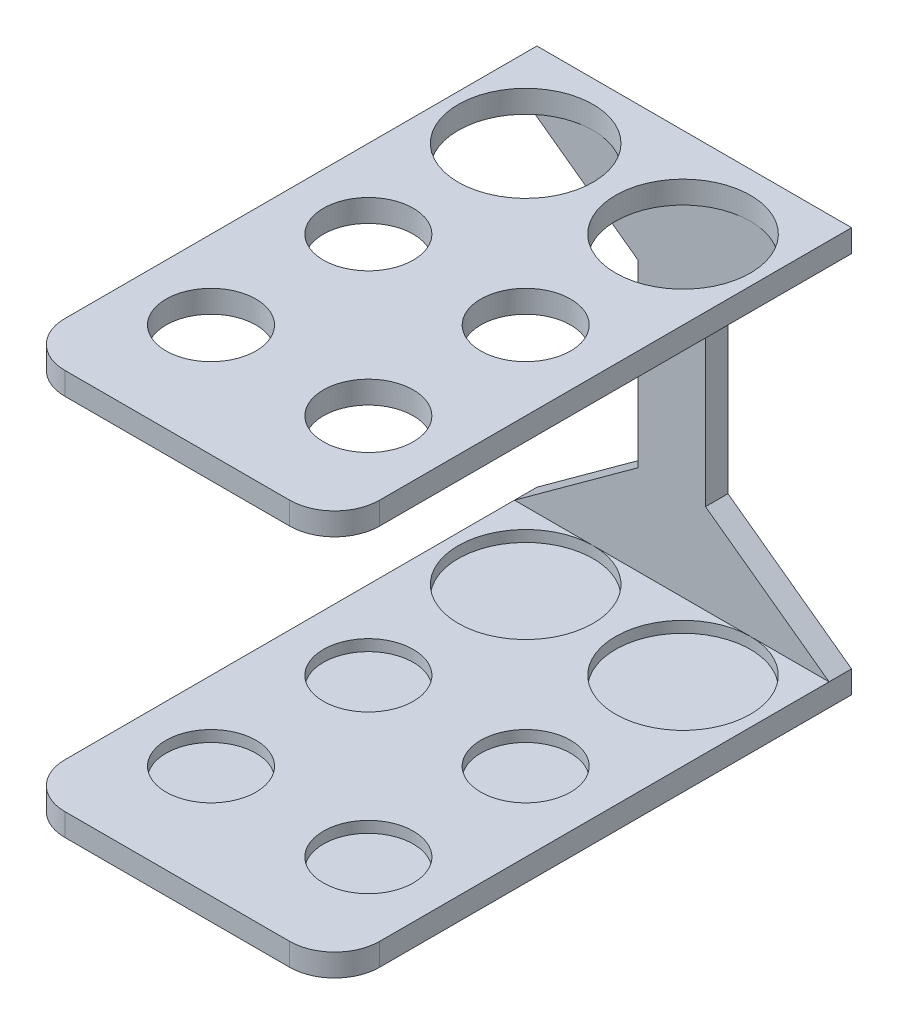
ISO-10303-21;
HEADER;
FILE_DESCRIPTION(('STEP AP214'),'2;1');
FILE_NAME('part.step','',(''),(''),'','','');
FILE_SCHEMA(('AUTOMOTIVE_DESIGN { 1 0 10303 214 1 1 1 1 }'));
ENDSEC;
DATA;
#1=APPLICATION_CONTEXT('core data for automotive mechanical design processes');
#2=APPLICATION_PROTOCOL_DEFINITION('international standard','automotive_design',2000,#1);
#3=PRODUCT_CONTEXT('',#1,'mechanical');
#4=PRODUCT('Part','Part','',(#3));
#5=PRODUCT_RELATED_PRODUCT_CATEGORY('part','',(#4));
#6=PRODUCT_DEFINITION_FORMATION('','',#4);
#7=PRODUCT_DEFINITION_CONTEXT('part definition',#1,'design');
#8=PRODUCT_DEFINITION('design','',#6,#7);
#9=PRODUCT_DEFINITION_SHAPE('','',#8);
#10=(LENGTH_UNIT() NAMED_UNIT(*) SI_UNIT(.MILLI.,.METRE.));
#11=(NAMED_UNIT(*) PLANE_ANGLE_UNIT() SI_UNIT($,.RADIAN.));
#12=(NAMED_UNIT(*) SI_UNIT($,.STERADIAN.) SOLID_ANGLE_UNIT());
#13=UNCERTAINTY_MEASURE_WITH_UNIT(LENGTH_MEASURE(1.E-05),#10,'distance_accuracy_value','');
#14=(GEOMETRIC_REPRESENTATION_CONTEXT(3) GLOBAL_UNCERTAINTY_ASSIGNED_CONTEXT((#13)) GLOBAL_UNIT_ASSIGNED_CONTEXT((#10,
#11,#12)) REPRESENTATION_CONTEXT('',''));
#15=CARTESIAN_POINT('',(0.,0.,0.));
#16=DIRECTION('',(0.,0.,1.));
#17=DIRECTION('',(1.,0.,0.));
#18=AXIS2_PLACEMENT_3D('',#15,#16,#17);
#19=CARTESIAN_POINT('',(88.9,0.,0.));
#20=DIRECTION('',(1.,0.,0.));
#21=DIRECTION('',(0.,0.,-1.));
#22=AXIS2_PLACEMENT_3D('',#19,#20,#21);
#23=PLANE('',#22);
#24=DIRECTION('',(0.,0.,1.));
#25=VECTOR('',#24,1.);
#26=CARTESIAN_POINT('',(88.9,6.35,0.));
#27=LINE('',#26,#25);
#28=CARTESIAN_POINT('',(88.9,6.35,0.));
#29=VERTEX_POINT('',#28);
#30=CARTESIAN_POINT('',(88.9,6.35,127.));
#31=VERTEX_POINT('',#30);
#32=EDGE_CURVE('E359',#29,#31,#27,.T.);
#33=ORIENTED_EDGE('',*,*,#32,.T.);
#34=DIRECTION('',(0.,1.,0.));
#35=VECTOR('',#34,1.);
#36=CARTESIAN_POINT('',(88.9,0.,127.));
#37=LINE('',#36,#35);
#38=CARTESIAN_POINT('',(88.9,0.,127.));
#39=VERTEX_POINT('',#38);
#40=EDGE_CURVE('E284',#31,#39,#37,.F.);
#41=ORIENTED_EDGE('',*,*,#40,.T.);
#42=DIRECTION('',(0.,0.,-1.));
#43=VECTOR('',#42,1.);
#44=CARTESIAN_POINT('',(88.9,0.,0.));
#45=LINE('',#44,#43);
#46=CARTESIAN_POINT('',(88.9,0.,-6.35));
#47=VERTEX_POINT('',#46);
#48=EDGE_CURVE('E201',#39,#47,#45,.T.);
#49=ORIENTED_EDGE('',*,*,#48,.T.);
#50=DIRECTION('',(0.,1.,0.));
#51=VECTOR('',#50,1.);
#52=CARTESIAN_POINT('',(88.9,0.,-6.35));
#53=LINE('',#52,#51);
#54=CARTESIAN_POINT('',(88.9,6.35,-6.35));
#55=VERTEX_POINT('',#54);
#56=EDGE_CURVE('E195',#47,#55,#53,.T.);
#57=ORIENTED_EDGE('',*,*,#56,.T.);
#58=DIRECTION('',(0.,0.,1.));
#59=VECTOR('',#58,1.);
#60=CARTESIAN_POINT('',(88.9,6.35,-6.35));
#61=LINE('',#60,#59);
#62=EDGE_CURVE('E176',#55,#29,#61,.T.);
#63=ORIENTED_EDGE('',*,*,#62,.T.);
#64=EDGE_LOOP('',(#33,#41,#49,#57,#63));
#65=FACE_BOUND('',#64,.T.);
#66=ADVANCED_FACE('F35',(#65),#23,.T.);
#67=CARTESIAN_POINT('',(0.,0.,0.));
#68=DIRECTION('',(1.,0.,0.));
#69=DIRECTION('',(0.,0.,-1.));
#70=AXIS2_PLACEMENT_3D('',#67,#68,#69);
#71=PLANE('',#70);
#72=DIRECTION('',(0.,0.,1.));
#73=VECTOR('',#72,1.);
#74=CARTESIAN_POINT('',(0.,107.95,0.));
#75=LINE('',#74,#73);
#76=CARTESIAN_POINT('',(0.,107.95,0.));
#77=VERTEX_POINT('',#76);
#78=CARTESIAN_POINT('',(0.,107.95,127.));
#79=VERTEX_POINT('',#78);
#80=EDGE_CURVE('E214',#77,#79,#75,.T.);
#81=ORIENTED_EDGE('',*,*,#80,.T.);
#82=DIRECTION('',(0.,-1.,0.));
#83=VECTOR('',#82,1.);
#84=CARTESIAN_POINT('',(0.,1.11022302462517E-12,127.000000000001));
#85=LINE('',#84,#83);
#86=CARTESIAN_POINT('',(0.,114.3,127.));
#87=VERTEX_POINT('',#86);
#88=EDGE_CURVE('E58',#79,#87,#85,.F.);
#89=ORIENTED_EDGE('',*,*,#88,.T.);
#90=DIRECTION('',(0.,0.,1.));
#91=VECTOR('',#90,1.);
#92=CARTESIAN_POINT('',(0.,114.3,0.));
#93=LINE('',#92,#91);
#94=CARTESIAN_POINT('',(0.,114.3,-6.35));
#95=VERTEX_POINT('',#94);
#96=EDGE_CURVE('E212',#95,#87,#93,.T.);
#97=ORIENTED_EDGE('',*,*,#96,.F.);
#98=DIRECTION('',(0.,1.,0.));
#99=VECTOR('',#98,1.);
#100=CARTESIAN_POINT('',(0.,0.,-6.35));
#101=LINE('',#100,#99);
#102=CARTESIAN_POINT('',(0.,107.95,-6.35));
#103=VERTEX_POINT('',#102);
#104=EDGE_CURVE('E222',#103,#95,#101,.T.);
#105=ORIENTED_EDGE('',*,*,#104,.F.);
#106=DIRECTION('',(0.,0.,1.));
#107=VECTOR('',#106,1.);
#108=CARTESIAN_POINT('',(0.,107.95,-6.35));
#109=LINE('',#108,#107);
#110=EDGE_CURVE('E319',#103,#77,#109,.T.);
#111=ORIENTED_EDGE('',*,*,#110,.T.);
#112=EDGE_LOOP('',(#81,#89,#97,#105,#111));
#113=FACE_BOUND('',#112,.T.);
#114=ADVANCED_FACE('F317',(#113),#71,.F.);
#115=CARTESIAN_POINT('',(88.9,114.3,0.));
#116=DIRECTION('',(0.,-1.,0.));
#117=DIRECTION('',(0.,0.,-1.));
#118=AXIS2_PLACEMENT_3D('',#115,#116,#117);
#119=PLANE('',#118);
#120=CARTESIAN_POINT('',(66.675,114.3,63.5));
#121=DIRECTION('',(0.,1.,0.));
#122=DIRECTION('',(0.,0.,1.));
#123=AXIS2_PLACEMENT_3D('',#120,#121,#122);
#124=CIRCLE('',#123,12.7);
#125=CARTESIAN_POINT('',(66.675,114.3,76.2));
#126=VERTEX_POINT('',#125);
#127=EDGE_CURVE('E410',#126,#126,#124,.T.);
#128=ORIENTED_EDGE('',*,*,#127,.F.);
#129=EDGE_LOOP('',(#128));
#130=FACE_BOUND('',#129,.T.);
#131=CARTESIAN_POINT('',(66.675,114.3,107.95));
#132=DIRECTION('',(0.,1.,0.));
#133=DIRECTION('',(0.,0.,1.));
#134=AXIS2_PLACEMENT_3D('',#131,#132,#133);
#135=CIRCLE('',#134,12.7);
#136=CARTESIAN_POINT('',(66.675,114.3,120.65));
#137=VERTEX_POINT('',#136);
#138=EDGE_CURVE('E416',#137,#137,#135,.T.);
#139=ORIENTED_EDGE('',*,*,#138,.F.);
#140=EDGE_LOOP('',(#139));
#141=FACE_BOUND('',#140,.T.);
#142=CARTESIAN_POINT('',(22.225,114.3,107.95));
#143=DIRECTION('',(0.,1.,0.));
#144=DIRECTION('',(0.,0.,1.));
#145=AXIS2_PLACEMENT_3D('',#142,#143,#144);
#146=CIRCLE('',#145,12.7);
#147=CARTESIAN_POINT('',(22.225,114.3,120.65));
#148=VERTEX_POINT('',#147);
#149=EDGE_CURVE('E422',#148,#148,#146,.T.);
#150=ORIENTED_EDGE('',*,*,#149,.F.);
#151=EDGE_LOOP('',(#150));
#152=FACE_BOUND('',#151,.T.);
#153=CARTESIAN_POINT('',(22.225,114.3,63.5));
#154=DIRECTION('',(0.,1.,0.));
#155=DIRECTION('',(0.,0.,1.));
#156=AXIS2_PLACEMENT_3D('',#153,#154,#155);
#157=CIRCLE('',#156,12.7);
#158=CARTESIAN_POINT('',(22.225,114.3,76.2));
#159=VERTEX_POINT('',#158);
#160=EDGE_CURVE('E428',#159,#159,#157,.T.);
#161=ORIENTED_EDGE('',*,*,#160,.F.);
#162=EDGE_LOOP('',(#161));
#163=FACE_BOUND('',#162,.T.);
#164=CARTESIAN_POINT('',(22.225,114.3,19.05));
#165=DIRECTION('',(0.,1.,0.));
#166=DIRECTION('',(0.,0.,1.));
#167=AXIS2_PLACEMENT_3D('',#164,#165,#166);
#168=CIRCLE('',#167,19.05);
#169=CARTESIAN_POINT('',(22.225,114.3,38.1));
#170=VERTEX_POINT('',#169);
#171=EDGE_CURVE('E340',#170,#170,#168,.T.);
#172=ORIENTED_EDGE('',*,*,#171,.F.);
#173=EDGE_LOOP('',(#172));
#174=FACE_BOUND('',#173,.T.);
#175=CARTESIAN_POINT('',(66.675,114.3,19.05));
#176=DIRECTION('',(0.,1.,0.));
#177=DIRECTION('',(0.,0.,1.));
#178=AXIS2_PLACEMENT_3D('',#175,#176,#177);
#179=CIRCLE('',#178,19.05);
#180=CARTESIAN_POINT('',(66.675,114.3,38.1));
#181=VERTEX_POINT('',#180);
#182=EDGE_CURVE('E350',#181,#181,#179,.T.);
#183=ORIENTED_EDGE('',*,*,#182,.F.);
#184=EDGE_LOOP('',(#183));
#185=FACE_BOUND('',#184,.T.);
#186=ORIENTED_EDGE('',*,*,#96,.T.);
#187=CARTESIAN_POINT('',(12.7,114.3,127.));
#188=DIRECTION('',(0.,-1.,0.));
#189=DIRECTION('',(0.,0.,-1.));
#190=AXIS2_PLACEMENT_3D('',#187,#188,#189);
#191=CIRCLE('',#190,12.7);
#192=CARTESIAN_POINT('',(12.7,114.3,139.7));
#193=VERTEX_POINT('',#192);
#194=EDGE_CURVE('E43',#87,#193,#191,.F.);
#195=ORIENTED_EDGE('',*,*,#194,.T.);
#196=DIRECTION('',(-1.,0.,0.));
#197=VECTOR('',#196,1.);
#198=CARTESIAN_POINT('',(88.9,114.3,139.7));
#199=LINE('',#198,#197);
#200=CARTESIAN_POINT('',(76.2,114.3,139.7));
#201=VERTEX_POINT('',#200);
#202=EDGE_CURVE('E247',#201,#193,#199,.T.);
#203=ORIENTED_EDGE('',*,*,#202,.F.);
#204=CARTESIAN_POINT('',(76.2,114.3,127.));
#205=DIRECTION('',(0.,-1.,0.));
#206=DIRECTION('',(0.,0.,-1.));
#207=AXIS2_PLACEMENT_3D('',#204,#205,#206);
#208=CIRCLE('',#207,12.7);
#209=CARTESIAN_POINT('',(88.9,114.3,127.));
#210=VERTEX_POINT('',#209);
#211=EDGE_CURVE('E50',#201,#210,#208,.F.);
#212=ORIENTED_EDGE('',*,*,#211,.T.);
#213=DIRECTION('',(0.,0.,1.));
#214=VECTOR('',#213,1.);
#215=CARTESIAN_POINT('',(88.9,114.3,0.));
#216=LINE('',#215,#214);
#217=CARTESIAN_POINT('',(88.9,114.3,-6.35));
#218=VERTEX_POINT('',#217);
#219=EDGE_CURVE('E225',#218,#210,#216,.T.);
#220=ORIENTED_EDGE('',*,*,#219,.F.);
#221=DIRECTION('',(-1.,0.,0.));
#222=VECTOR('',#221,1.);
#223=CARTESIAN_POINT('',(88.9,114.3,-6.35));
#224=LINE('',#223,#222);
#225=EDGE_CURVE('E203',#218,#95,#224,.T.);
#226=ORIENTED_EDGE('',*,*,#225,.T.);
#227=EDGE_LOOP('',(#186,#195,#203,#212,#220,#226));
#228=FACE_BOUND('',#227,.T.);
#229=ADVANCED_FACE('F304',(#130,#141,#152,#163,#174,#185,#228),#119,.F.);
#230=CARTESIAN_POINT('',(88.9,1.22124532708768E-12,139.700000000001));
#231=DIRECTION('',(0.,0.,-1.));
#232=DIRECTION('',(0.,1.,0.));
#233=AXIS2_PLACEMENT_3D('',#230,#231,#232);
#234=PLANE('',#233);
#235=ORIENTED_EDGE('',*,*,#202,.T.);
#236=DIRECTION('',(0.,-1.,0.));
#237=VECTOR('',#236,1.);
#238=CARTESIAN_POINT('',(12.7,1.22124532708768E-12,139.700000000001));
#239=LINE('',#238,#237);
#240=CARTESIAN_POINT('',(12.7,107.95,139.7));
#241=VERTEX_POINT('',#240);
#242=EDGE_CURVE('E295',#193,#241,#239,.T.);
#243=ORIENTED_EDGE('',*,*,#242,.T.);
#244=DIRECTION('',(-1.,0.,0.));
#245=VECTOR('',#244,1.);
#246=CARTESIAN_POINT('',(88.9,107.95,139.7));
#247=LINE('',#246,#245);
#248=CARTESIAN_POINT('',(76.2,107.95,139.7));
#249=VERTEX_POINT('',#248);
#250=EDGE_CURVE('E243',#249,#241,#247,.T.);
#251=ORIENTED_EDGE('',*,*,#250,.F.);
#252=DIRECTION('',(0.,-1.,0.));
#253=VECTOR('',#252,1.);
#254=CARTESIAN_POINT('',(76.2,114.3,139.7));
#255=LINE('',#254,#253);
#256=EDGE_CURVE('E293',#249,#201,#255,.F.);
#257=ORIENTED_EDGE('',*,*,#256,.T.);
#258=EDGE_LOOP('',(#235,#243,#251,#257));
#259=FACE_BOUND('',#258,.T.);
#260=ADVANCED_FACE('F308',(#259),#234,.F.);
#261=CARTESIAN_POINT('',(88.9,107.95,0.));
#262=DIRECTION('',(0.,-1.,0.));
#263=DIRECTION('',(0.,0.,-1.));
#264=AXIS2_PLACEMENT_3D('',#261,#262,#263);
#265=PLANE('',#264);
#266=CARTESIAN_POINT('',(66.675,107.95,63.5));
#267=DIRECTION('',(0.,-1.,0.));
#268=DIRECTION('',(0.,0.,-1.));
#269=AXIS2_PLACEMENT_3D('',#266,#267,#268);
#270=CIRCLE('',#269,12.7);
#271=CARTESIAN_POINT('',(66.675,107.95,50.8));
#272=VERTEX_POINT('',#271);
#273=EDGE_CURVE('E275',#272,#272,#270,.T.);
#274=ORIENTED_EDGE('',*,*,#273,.F.);
#275=EDGE_LOOP('',(#274));
#276=FACE_BOUND('',#275,.T.);
#277=CARTESIAN_POINT('',(66.675,107.95,107.95));
#278=DIRECTION('',(0.,-1.,0.));
#279=DIRECTION('',(0.,0.,-1.));
#280=AXIS2_PLACEMENT_3D('',#277,#278,#279);
#281=CIRCLE('',#280,12.7);
#282=CARTESIAN_POINT('',(66.675,107.95,95.25));
#283=VERTEX_POINT('',#282);
#284=EDGE_CURVE('E271',#283,#283,#281,.T.);
#285=ORIENTED_EDGE('',*,*,#284,.F.);
#286=EDGE_LOOP('',(#285));
#287=FACE_BOUND('',#286,.T.);
#288=CARTESIAN_POINT('',(22.225,107.95,107.95));
#289=DIRECTION('',(0.,-1.,0.));
#290=DIRECTION('',(0.,0.,-1.));
#291=AXIS2_PLACEMENT_3D('',#288,#289,#290);
#292=CIRCLE('',#291,12.7);
#293=CARTESIAN_POINT('',(22.225,107.95,95.25));
#294=VERTEX_POINT('',#293);
#295=EDGE_CURVE('E267',#294,#294,#292,.T.);
#296=ORIENTED_EDGE('',*,*,#295,.F.);
#297=EDGE_LOOP('',(#296));
#298=FACE_BOUND('',#297,.T.);
#299=CARTESIAN_POINT('',(22.225,107.95,63.5));
#300=DIRECTION('',(0.,-1.,0.));
#301=DIRECTION('',(0.,0.,-1.));
#302=AXIS2_PLACEMENT_3D('',#299,#300,#301);
#303=CIRCLE('',#302,12.7);
#304=CARTESIAN_POINT('',(22.225,107.95,50.8));
#305=VERTEX_POINT('',#304);
#306=EDGE_CURVE('E263',#305,#305,#303,.T.);
#307=ORIENTED_EDGE('',*,*,#306,.F.);
#308=EDGE_LOOP('',(#307));
#309=FACE_BOUND('',#308,.T.);
#310=ORIENTED_EDGE('',*,*,#250,.T.);
#311=CARTESIAN_POINT('',(12.7,107.95,127.));
#312=DIRECTION('',(0.,-1.,0.));
#313=DIRECTION('',(0.,0.,-1.));
#314=AXIS2_PLACEMENT_3D('',#311,#312,#313);
#315=CIRCLE('',#314,12.7);
#316=EDGE_CURVE('E300',#241,#79,#315,.T.);
#317=ORIENTED_EDGE('',*,*,#316,.T.);
#318=ORIENTED_EDGE('',*,*,#80,.F.);
#319=DIRECTION('',(-1.,0.,0.));
#320=VECTOR('',#319,1.);
#321=CARTESIAN_POINT('',(88.9,107.95,0.));
#322=LINE('',#321,#320);
#323=CARTESIAN_POINT('',(22.225,107.95,0.));
#324=VERTEX_POINT('',#323);
#325=EDGE_CURVE('E238',#324,#77,#322,.T.);
#326=ORIENTED_EDGE('',*,*,#325,.F.);
#327=CARTESIAN_POINT('',(22.225,107.95,19.05));
#328=DIRECTION('',(0.,-1.,0.));
#329=DIRECTION('',(0.,0.,-1.));
#330=AXIS2_PLACEMENT_3D('',#327,#328,#329);
#331=CIRCLE('',#330,19.05);
#332=EDGE_CURVE('E258',#324,#324,#331,.T.);
#333=ORIENTED_EDGE('',*,*,#332,.F.);
#334=CARTESIAN_POINT('',(66.675,107.95,0.));
#335=VERTEX_POINT('',#334);
#336=EDGE_CURVE('E244',#335,#324,#322,.T.);
#337=ORIENTED_EDGE('',*,*,#336,.F.);
#338=CARTESIAN_POINT('',(66.675,107.95,19.05));
#339=DIRECTION('',(0.,-1.,0.));
#340=DIRECTION('',(0.,0.,-1.));
#341=AXIS2_PLACEMENT_3D('',#338,#339,#340);
#342=CIRCLE('',#341,19.05);
#343=EDGE_CURVE('E215',#335,#335,#342,.T.);
#344=ORIENTED_EDGE('',*,*,#343,.F.);
#345=CARTESIAN_POINT('',(88.9,107.95,0.));
#346=VERTEX_POINT('',#345);
#347=EDGE_CURVE('E240',#346,#335,#322,.T.);
#348=ORIENTED_EDGE('',*,*,#347,.F.);
#349=DIRECTION('',(0.,0.,1.));
#350=VECTOR('',#349,1.);
#351=CARTESIAN_POINT('',(88.9,107.95,0.));
#352=LINE('',#351,#350);
#353=CARTESIAN_POINT('',(88.9,107.95,127.));
#354=VERTEX_POINT('',#353);
#355=EDGE_CURVE('E357',#346,#354,#352,.T.);
#356=ORIENTED_EDGE('',*,*,#355,.T.);
#357=CARTESIAN_POINT('',(76.2,107.95,127.));
#358=DIRECTION('',(0.,-1.,0.));
#359=DIRECTION('',(0.,0.,-1.));
#360=AXIS2_PLACEMENT_3D('',#357,#358,#359);
#361=CIRCLE('',#360,12.7);
#362=EDGE_CURVE('E298',#354,#249,#361,.T.);
#363=ORIENTED_EDGE('',*,*,#362,.T.);
#364=EDGE_LOOP('',(#310,#317,#318,#326,#333,#337,#344,#348,#356,#363));
#365=FACE_BOUND('',#364,.T.);
#366=ADVANCED_FACE('F314',(#276,#287,#298,#309,#365),#265,.T.);
#367=CARTESIAN_POINT('',(88.9,0.,0.));
#368=DIRECTION('',(0.,0.,1.));
#369=DIRECTION('',(0.,-1.,0.));
#370=AXIS2_PLACEMENT_3D('',#367,#368,#369);
#371=PLANE('',#370);
#372=DIRECTION('',(0.808736084303189,-0.588171697675046,0.));
#373=VECTOR('',#372,1.);
#374=CARTESIAN_POINT('',(91.9205405405405,4.15324324324324,0.));
#375=LINE('',#374,#373);
#376=CARTESIAN_POINT('',(53.975,31.75,0.));
#377=VERTEX_POINT('',#376);
#378=EDGE_CURVE('E183',#377,#29,#375,.T.);
#379=ORIENTED_EDGE('',*,*,#378,.F.);
#380=DIRECTION('',(0.,-1.,0.));
#381=VECTOR('',#380,1.);
#382=CARTESIAN_POINT('',(53.975,0.,0.));
#383=LINE('',#382,#381);
#384=CARTESIAN_POINT('',(53.975,82.55,0.));
#385=VERTEX_POINT('',#384);
#386=EDGE_CURVE('E392',#385,#377,#383,.T.);
#387=ORIENTED_EDGE('',*,*,#386,.F.);
#388=DIRECTION('',(-0.808736084303189,-0.588171697675046,0.));
#389=VECTOR('',#388,1.);
#390=CARTESIAN_POINT('',(37.5508108108108,70.6051351351351,0.));
#391=LINE('',#390,#389);
#392=EDGE_CURVE('E497',#346,#385,#391,.T.);
#393=ORIENTED_EDGE('',*,*,#392,.F.);
#394=ORIENTED_EDGE('',*,*,#347,.T.);
#395=ORIENTED_EDGE('',*,*,#336,.T.);
#396=ORIENTED_EDGE('',*,*,#325,.T.);
#397=DIRECTION('',(-0.808736084303189,0.588171697675046,0.));
#398=VECTOR('',#397,1.);
#399=CARTESIAN_POINT('',(109.494594594595,28.3175675675676,0.));
#400=LINE('',#399,#398);
#401=CARTESIAN_POINT('',(34.925,82.55,0.));
#402=VERTEX_POINT('',#401);
#403=EDGE_CURVE('E332',#402,#77,#400,.T.);
#404=ORIENTED_EDGE('',*,*,#403,.F.);
#405=DIRECTION('',(0.,1.,0.));
#406=VECTOR('',#405,1.);
#407=CARTESIAN_POINT('',(34.925,0.,0.));
#408=LINE('',#407,#406);
#409=CARTESIAN_POINT('',(34.925,31.75,0.));
#410=VERTEX_POINT('',#409);
#411=EDGE_CURVE('E406',#410,#402,#408,.T.);
#412=ORIENTED_EDGE('',*,*,#411,.F.);
#413=DIRECTION('',(0.808736084303189,0.588171697675046,0.));
#414=VECTOR('',#413,1.);
#415=CARTESIAN_POINT('',(55.1248648648649,46.4408108108108,0.));
#416=LINE('',#415,#414);
#417=CARTESIAN_POINT('',(0.,6.35,0.));
#418=VERTEX_POINT('',#417);
#419=EDGE_CURVE('E399',#418,#410,#416,.T.);
#420=ORIENTED_EDGE('',*,*,#419,.F.);
#421=DIRECTION('',(-1.,0.,0.));
#422=VECTOR('',#421,1.);
#423=CARTESIAN_POINT('',(88.9,6.35,0.));
#424=LINE('',#423,#422);
#425=CARTESIAN_POINT('',(22.225,6.35,0.));
#426=VERTEX_POINT('',#425);
#427=EDGE_CURVE('E234',#426,#418,#424,.T.);
#428=ORIENTED_EDGE('',*,*,#427,.F.);
#429=CARTESIAN_POINT('',(66.675,6.35,0.));
#430=VERTEX_POINT('',#429);
#431=EDGE_CURVE('E239',#430,#426,#424,.T.);
#432=ORIENTED_EDGE('',*,*,#431,.F.);
#433=EDGE_CURVE('E235',#29,#430,#424,.T.);
#434=ORIENTED_EDGE('',*,*,#433,.F.);
#435=EDGE_LOOP('',(#379,#387,#393,#394,#395,#396,#404,#412,#420,#428,#432,#434));
#436=FACE_BOUND('',#435,.T.);
#437=ADVANCED_FACE('F330',(#436),#371,.T.);
#438=CARTESIAN_POINT('',(88.9,6.35,0.));
#439=DIRECTION('',(0.,-1.,0.));
#440=DIRECTION('',(0.,0.,-1.));
#441=AXIS2_PLACEMENT_3D('',#438,#439,#440);
#442=PLANE('',#441);
#443=CARTESIAN_POINT('',(66.675,6.35,63.5));
#444=DIRECTION('',(0.,-1.,0.));
#445=DIRECTION('',(0.,0.,-1.));
#446=AXIS2_PLACEMENT_3D('',#443,#444,#445);
#447=CIRCLE('',#446,12.7);
#448=CARTESIAN_POINT('',(66.675,6.35,50.8));
#449=VERTEX_POINT('',#448);
#450=EDGE_CURVE('E272',#449,#449,#447,.T.);
#451=ORIENTED_EDGE('',*,*,#450,.T.);
#452=EDGE_LOOP('',(#451));
#453=FACE_BOUND('',#452,.T.);
#454=CARTESIAN_POINT('',(66.675,6.35,107.95));
#455=DIRECTION('',(0.,-1.,0.));
#456=DIRECTION('',(0.,0.,-1.));
#457=AXIS2_PLACEMENT_3D('',#454,#455,#456);
#458=CIRCLE('',#457,12.7);
#459=CARTESIAN_POINT('',(66.675,6.35,95.25));
#460=VERTEX_POINT('',#459);
#461=EDGE_CURVE('E268',#460,#460,#458,.T.);
#462=ORIENTED_EDGE('',*,*,#461,.T.);
#463=EDGE_LOOP('',(#462));
#464=FACE_BOUND('',#463,.T.);
#465=CARTESIAN_POINT('',(22.225,6.35,107.95));
#466=DIRECTION('',(0.,-1.,0.));
#467=DIRECTION('',(0.,0.,-1.));
#468=AXIS2_PLACEMENT_3D('',#465,#466,#467);
#469=CIRCLE('',#468,12.7);
#470=CARTESIAN_POINT('',(22.225,6.35,95.25));
#471=VERTEX_POINT('',#470);
#472=EDGE_CURVE('E264',#471,#471,#469,.T.);
#473=ORIENTED_EDGE('',*,*,#472,.T.);
#474=EDGE_LOOP('',(#473));
#475=FACE_BOUND('',#474,.T.);
#476=CARTESIAN_POINT('',(22.225,6.35,63.5));
#477=DIRECTION('',(0.,-1.,0.));
#478=DIRECTION('',(0.,0.,-1.));
#479=AXIS2_PLACEMENT_3D('',#476,#477,#478);
#480=CIRCLE('',#479,12.7);
#481=CARTESIAN_POINT('',(22.225,6.35,50.8));
#482=VERTEX_POINT('',#481);
#483=EDGE_CURVE('E260',#482,#482,#480,.T.);
#484=ORIENTED_EDGE('',*,*,#483,.T.);
#485=EDGE_LOOP('',(#484));
#486=FACE_BOUND('',#485,.T.);
#487=DIRECTION('',(-1.,0.,0.));
#488=VECTOR('',#487,1.);
#489=CARTESIAN_POINT('',(88.9,6.35,139.7));
#490=LINE('',#489,#488);
#491=CARTESIAN_POINT('',(76.2,6.35,139.7));
#492=VERTEX_POINT('',#491);
#493=CARTESIAN_POINT('',(12.7,6.35,139.7));
#494=VERTEX_POINT('',#493);
#495=EDGE_CURVE('E231',#492,#494,#490,.T.);
#496=ORIENTED_EDGE('',*,*,#495,.F.);
#497=CARTESIAN_POINT('',(76.2,6.35,127.));
#498=DIRECTION('',(0.,-1.,0.));
#499=DIRECTION('',(0.,0.,-1.));
#500=AXIS2_PLACEMENT_3D('',#497,#498,#499);
#501=CIRCLE('',#500,12.7);
#502=EDGE_CURVE('E282',#492,#31,#501,.F.);
#503=ORIENTED_EDGE('',*,*,#502,.T.);
#504=ORIENTED_EDGE('',*,*,#32,.F.);
#505=ORIENTED_EDGE('',*,*,#433,.T.);
#506=CARTESIAN_POINT('',(66.675,6.35,19.05));
#507=DIRECTION('',(0.,-1.,0.));
#508=DIRECTION('',(0.,0.,-1.));
#509=AXIS2_PLACEMENT_3D('',#506,#507,#508);
#510=CIRCLE('',#509,19.05);
#511=EDGE_CURVE('E251',#430,#430,#510,.T.);
#512=ORIENTED_EDGE('',*,*,#511,.T.);
#513=ORIENTED_EDGE('',*,*,#431,.T.);
#514=CARTESIAN_POINT('',(22.225,6.35,19.05));
#515=DIRECTION('',(0.,-1.,0.));
#516=DIRECTION('',(0.,0.,-1.));
#517=AXIS2_PLACEMENT_3D('',#514,#515,#516);
#518=CIRCLE('',#517,19.05);
#519=EDGE_CURVE('E255',#426,#426,#518,.T.);
#520=ORIENTED_EDGE('',*,*,#519,.T.);
#521=ORIENTED_EDGE('',*,*,#427,.T.);
#522=DIRECTION('',(0.,0.,1.));
#523=VECTOR('',#522,1.);
#524=CARTESIAN_POINT('',(0.,6.35,0.));
#525=LINE('',#524,#523);
#526=CARTESIAN_POINT('',(0.,6.35,127.));
#527=VERTEX_POINT('',#526);
#528=EDGE_CURVE('E217',#418,#527,#525,.T.);
#529=ORIENTED_EDGE('',*,*,#528,.T.);
#530=CARTESIAN_POINT('',(12.7,6.35,127.));
#531=DIRECTION('',(0.,-1.,0.));
#532=DIRECTION('',(0.,0.,-1.));
#533=AXIS2_PLACEMENT_3D('',#530,#531,#532);
#534=CIRCLE('',#533,12.7);
#535=EDGE_CURVE('E280',#527,#494,#534,.F.);
#536=ORIENTED_EDGE('',*,*,#535,.T.);
#537=EDGE_LOOP('',(#496,#503,#504,#505,#512,#513,#520,#521,#529,#536));
#538=FACE_BOUND('',#537,.T.);
#539=ADVANCED_FACE('F495',(#453,#464,#475,#486,#538),#442,.F.);
#540=CARTESIAN_POINT('',(88.9,0.,139.7));
#541=DIRECTION('',(0.,0.,1.));
#542=DIRECTION('',(1.,0.,0.));
#543=AXIS2_PLACEMENT_3D('',#540,#541,#542);
#544=PLANE('',#543);
#545=DIRECTION('',(-1.,0.,0.));
#546=VECTOR('',#545,1.);
#547=CARTESIAN_POINT('',(88.9,0.,139.7));
#548=LINE('',#547,#546);
#549=CARTESIAN_POINT('',(76.2,0.,139.7));
#550=VERTEX_POINT('',#549);
#551=CARTESIAN_POINT('',(12.7,0.,139.7));
#552=VERTEX_POINT('',#551);
#553=EDGE_CURVE('E228',#550,#552,#548,.T.);
#554=ORIENTED_EDGE('',*,*,#553,.F.);
#555=DIRECTION('',(0.,1.,0.));
#556=VECTOR('',#555,1.);
#557=CARTESIAN_POINT('',(76.2,0.,139.7));
#558=LINE('',#557,#556);
#559=EDGE_CURVE('E277',#550,#492,#558,.T.);
#560=ORIENTED_EDGE('',*,*,#559,.T.);
#561=ORIENTED_EDGE('',*,*,#495,.T.);
#562=DIRECTION('',(0.,1.,0.));
#563=VECTOR('',#562,1.);
#564=CARTESIAN_POINT('',(12.7,0.,139.7));
#565=LINE('',#564,#563);
#566=EDGE_CURVE('E250',#494,#552,#565,.F.);
#567=ORIENTED_EDGE('',*,*,#566,.T.);
#568=EDGE_LOOP('',(#554,#560,#561,#567));
#569=FACE_BOUND('',#568,.T.);
#570=ADVANCED_FACE('F372',(#569),#544,.T.);
#571=CARTESIAN_POINT('',(88.9,0.,0.));
#572=DIRECTION('',(0.,1.,0.));
#573=DIRECTION('',(0.,0.,1.));
#574=AXIS2_PLACEMENT_3D('',#571,#572,#573);
#575=PLANE('',#574);
#576=ORIENTED_EDGE('',*,*,#48,.F.);
#577=CARTESIAN_POINT('',(76.2,0.,127.));
#578=DIRECTION('',(0.,1.,0.));
#579=DIRECTION('',(0.,0.,1.));
#580=AXIS2_PLACEMENT_3D('',#577,#578,#579);
#581=CIRCLE('',#580,12.7);
#582=EDGE_CURVE('E288',#39,#550,#581,.F.);
#583=ORIENTED_EDGE('',*,*,#582,.T.);
#584=ORIENTED_EDGE('',*,*,#553,.T.);
#585=CARTESIAN_POINT('',(12.7,0.,127.));
#586=DIRECTION('',(0.,1.,0.));
#587=DIRECTION('',(0.,0.,1.));
#588=AXIS2_PLACEMENT_3D('',#585,#586,#587);
#589=CIRCLE('',#588,12.7);
#590=CARTESIAN_POINT('',(0.,0.,127.));
#591=VERTEX_POINT('',#590);
#592=EDGE_CURVE('E286',#552,#591,#589,.F.);
#593=ORIENTED_EDGE('',*,*,#592,.T.);
#594=DIRECTION('',(0.,0.,-1.));
#595=VECTOR('',#594,1.);
#596=CARTESIAN_POINT('',(0.,0.,0.));
#597=LINE('',#596,#595);
#598=CARTESIAN_POINT('',(0.,0.,-6.35));
#599=VERTEX_POINT('',#598);
#600=EDGE_CURVE('E220',#591,#599,#597,.T.);
#601=ORIENTED_EDGE('',*,*,#600,.T.);
#602=DIRECTION('',(-1.,0.,0.));
#603=VECTOR('',#602,1.);
#604=CARTESIAN_POINT('',(88.9,0.,-6.35));
#605=LINE('',#604,#603);
#606=EDGE_CURVE('E207',#47,#599,#605,.T.);
#607=ORIENTED_EDGE('',*,*,#606,.F.);
#608=EDGE_LOOP('',(#576,#583,#584,#593,#601,#607));
#609=FACE_BOUND('',#608,.T.);
#610=ADVANCED_FACE('F369',(#609),#575,.F.);
#611=CARTESIAN_POINT('',(88.9,0.,-6.35));
#612=DIRECTION('',(0.,0.,1.));
#613=DIRECTION('',(1.,0.,0.));
#614=AXIS2_PLACEMENT_3D('',#611,#612,#613);
#615=PLANE('',#614);
#616=DIRECTION('',(0.,-1.,0.));
#617=VECTOR('',#616,1.);
#618=CARTESIAN_POINT('',(53.975,82.55,-6.35));
#619=LINE('',#618,#617);
#620=CARTESIAN_POINT('',(53.975,82.55,-6.35));
#621=VERTEX_POINT('',#620);
#622=CARTESIAN_POINT('',(53.975,31.75,-6.35));
#623=VERTEX_POINT('',#622);
#624=EDGE_CURVE('E189',#621,#623,#619,.T.);
#625=ORIENTED_EDGE('',*,*,#624,.T.);
#626=DIRECTION('',(0.808736084303189,-0.588171697675046,0.));
#627=VECTOR('',#626,1.);
#628=CARTESIAN_POINT('',(88.9,6.35,-6.35));
#629=LINE('',#628,#627);
#630=EDGE_CURVE('E180',#623,#55,#629,.T.);
#631=ORIENTED_EDGE('',*,*,#630,.T.);
#632=ORIENTED_EDGE('',*,*,#56,.F.);
#633=ORIENTED_EDGE('',*,*,#606,.T.);
#634=CARTESIAN_POINT('',(0.,6.35,-6.35));
#635=VERTEX_POINT('',#634);
#636=EDGE_CURVE('E223',#599,#635,#101,.T.);
#637=ORIENTED_EDGE('',*,*,#636,.T.);
#638=DIRECTION('',(0.808736084303189,0.588171697675046,0.));
#639=VECTOR('',#638,1.);
#640=CARTESIAN_POINT('',(34.925,31.75,-6.35));
#641=LINE('',#640,#639);
#642=CARTESIAN_POINT('',(34.925,31.75,-6.35));
#643=VERTEX_POINT('',#642);
#644=EDGE_CURVE('E386',#635,#643,#641,.T.);
#645=ORIENTED_EDGE('',*,*,#644,.T.);
#646=DIRECTION('',(0.,1.,0.));
#647=VECTOR('',#646,1.);
#648=CARTESIAN_POINT('',(34.925,31.75,-6.35));
#649=LINE('',#648,#647);
#650=CARTESIAN_POINT('',(34.925,82.55,-6.35));
#651=VERTEX_POINT('',#650);
#652=EDGE_CURVE('E325',#643,#651,#649,.T.);
#653=ORIENTED_EDGE('',*,*,#652,.T.);
#654=DIRECTION('',(-0.808736084303189,0.588171697675046,0.));
#655=VECTOR('',#654,1.);
#656=CARTESIAN_POINT('',(34.925,82.55,-6.35));
#657=LINE('',#656,#655);
#658=EDGE_CURVE('E389',#651,#103,#657,.T.);
#659=ORIENTED_EDGE('',*,*,#658,.T.);
#660=ORIENTED_EDGE('',*,*,#104,.T.);
#661=ORIENTED_EDGE('',*,*,#225,.F.);
#662=CARTESIAN_POINT('',(88.9,107.95,-6.35));
#663=VERTEX_POINT('',#662);
#664=EDGE_CURVE('E204',#663,#218,#53,.T.);
#665=ORIENTED_EDGE('',*,*,#664,.F.);
#666=DIRECTION('',(-0.808736084303189,-0.588171697675046,0.));
#667=VECTOR('',#666,1.);
#668=CARTESIAN_POINT('',(53.975,82.55,-6.35));
#669=LINE('',#668,#667);
#670=EDGE_CURVE('E198',#663,#621,#669,.T.);
#671=ORIENTED_EDGE('',*,*,#670,.T.);
#672=EDGE_LOOP('',(#625,#631,#632,#633,#637,#645,#653,#659,#660,#661,#665,#671));
#673=FACE_BOUND('',#672,.T.);
#674=ADVANCED_FACE('F193',(#673),#615,.F.);
#675=ORIENTED_EDGE('',*,*,#219,.T.);
#676=DIRECTION('',(0.,-1.,0.));
#677=VECTOR('',#676,1.);
#678=CARTESIAN_POINT('',(88.9,107.95,127.));
#679=LINE('',#678,#677);
#680=EDGE_CURVE('E11',#210,#354,#679,.T.);
#681=ORIENTED_EDGE('',*,*,#680,.T.);
#682=ORIENTED_EDGE('',*,*,#355,.F.);
#683=DIRECTION('',(0.,0.,1.));
#684=VECTOR('',#683,1.);
#685=CARTESIAN_POINT('',(88.9,107.95,-6.35));
#686=LINE('',#685,#684);
#687=EDGE_CURVE('E188',#663,#346,#686,.T.);
#688=ORIENTED_EDGE('',*,*,#687,.F.);
#689=ORIENTED_EDGE('',*,*,#664,.T.);
#690=EDGE_LOOP('',(#675,#681,#682,#688,#689));
#691=FACE_BOUND('',#690,.T.);
#692=ADVANCED_FACE('F462',(#691),#23,.T.);
#693=ORIENTED_EDGE('',*,*,#600,.F.);
#694=DIRECTION('',(0.,1.,0.));
#695=VECTOR('',#694,1.);
#696=CARTESIAN_POINT('',(0.,6.35,127.));
#697=LINE('',#696,#695);
#698=EDGE_CURVE('E290',#591,#527,#697,.T.);
#699=ORIENTED_EDGE('',*,*,#698,.T.);
#700=ORIENTED_EDGE('',*,*,#528,.F.);
#701=DIRECTION('',(0.,0.,1.));
#702=VECTOR('',#701,1.);
#703=CARTESIAN_POINT('',(0.,6.35,-6.35));
#704=LINE('',#703,#702);
#705=EDGE_CURVE('E324',#635,#418,#704,.T.);
#706=ORIENTED_EDGE('',*,*,#705,.F.);
#707=ORIENTED_EDGE('',*,*,#636,.F.);
#708=EDGE_LOOP('',(#693,#699,#700,#706,#707));
#709=FACE_BOUND('',#708,.T.);
#710=ADVANCED_FACE('F381',(#709),#71,.F.);
#711=CARTESIAN_POINT('',(66.675,3.175,19.05));
#712=DIRECTION('',(0.,1.,0.));
#713=DIRECTION('',(0.,0.,1.));
#714=AXIS2_PLACEMENT_3D('',#711,#712,#713);
#715=PLANE('',#714);
#716=CARTESIAN_POINT('',(66.675,3.175,19.05));
#717=DIRECTION('',(0.,1.,0.));
#718=DIRECTION('',(0.,0.,1.));
#719=AXIS2_PLACEMENT_3D('',#716,#717,#718);
#720=CIRCLE('',#719,19.05);
#721=CARTESIAN_POINT('',(66.675,3.175,38.1));
#722=VERTEX_POINT('',#721);
#723=EDGE_CURVE('E254',#722,#722,#720,.T.);
#724=ORIENTED_EDGE('',*,*,#723,.T.);
#725=EDGE_LOOP('',(#724));
#726=FACE_BOUND('',#725,.T.);
#727=ADVANCED_FACE('F457',(#726),#715,.T.);
#728=CARTESIAN_POINT('',(66.675,3.175,19.05));
#729=DIRECTION('',(0.,1.,0.));
#730=DIRECTION('',(0.,0.,1.));
#731=AXIS2_PLACEMENT_3D('',#728,#729,#730);
#732=CYLINDRICAL_SURFACE('',#731,19.05);
#733=ORIENTED_EDGE('',*,*,#723,.F.);
#734=EDGE_LOOP('',(#733));
#735=FACE_BOUND('',#734,.T.);
#736=ORIENTED_EDGE('',*,*,#511,.F.);
#737=EDGE_LOOP('',(#736));
#738=FACE_BOUND('',#737,.T.);
#739=ADVANCED_FACE('F448',(#735,#738),#732,.F.);
#740=ORIENTED_EDGE('',*,*,#343,.T.);
#741=EDGE_LOOP('',(#740));
#742=FACE_BOUND('',#741,.T.);
#743=ORIENTED_EDGE('',*,*,#182,.T.);
#744=EDGE_LOOP('',(#743));
#745=FACE_BOUND('',#744,.T.);
#746=ADVANCED_FACE('F445',(#742,#745),#732,.F.);
#747=CARTESIAN_POINT('',(22.225,3.175,19.05));
#748=DIRECTION('',(0.,1.,0.));
#749=DIRECTION('',(0.,0.,1.));
#750=AXIS2_PLACEMENT_3D('',#747,#748,#749);
#751=PLANE('',#750);
#752=CARTESIAN_POINT('',(22.225,3.175,19.05));
#753=DIRECTION('',(0.,1.,0.));
#754=DIRECTION('',(0.,0.,1.));
#755=AXIS2_PLACEMENT_3D('',#752,#753,#754);
#756=CIRCLE('',#755,19.05);
#757=CARTESIAN_POINT('',(22.225,3.175,38.1));
#758=VERTEX_POINT('',#757);
#759=EDGE_CURVE('E430',#758,#758,#756,.T.);
#760=ORIENTED_EDGE('',*,*,#759,.T.);
#761=EDGE_LOOP('',(#760));
#762=FACE_BOUND('',#761,.T.);
#763=ADVANCED_FACE('F447',(#762),#751,.T.);
#764=CARTESIAN_POINT('',(22.225,3.175,19.05));
#765=DIRECTION('',(0.,1.,0.));
#766=DIRECTION('',(0.,0.,1.));
#767=AXIS2_PLACEMENT_3D('',#764,#765,#766);
#768=CYLINDRICAL_SURFACE('',#767,19.05);
#769=ORIENTED_EDGE('',*,*,#759,.F.);
#770=EDGE_LOOP('',(#769));
#771=FACE_BOUND('',#770,.T.);
#772=ORIENTED_EDGE('',*,*,#519,.F.);
#773=EDGE_LOOP('',(#772));
#774=FACE_BOUND('',#773,.T.);
#775=ADVANCED_FACE('F455',(#771,#774),#768,.F.);
#776=CARTESIAN_POINT('',(22.225,3.175,63.5));
#777=DIRECTION('',(0.,1.,0.));
#778=DIRECTION('',(0.,0.,1.));
#779=AXIS2_PLACEMENT_3D('',#776,#777,#778);
#780=PLANE('',#779);
#781=CARTESIAN_POINT('',(22.225,3.175,63.5));
#782=DIRECTION('',(0.,1.,0.));
#783=DIRECTION('',(0.,0.,1.));
#784=AXIS2_PLACEMENT_3D('',#781,#782,#783);
#785=CIRCLE('',#784,12.7);
#786=CARTESIAN_POINT('',(22.225,3.175,76.2));
#787=VERTEX_POINT('',#786);
#788=EDGE_CURVE('E425',#787,#787,#785,.T.);
#789=ORIENTED_EDGE('',*,*,#788,.T.);
#790=EDGE_LOOP('',(#789));
#791=FACE_BOUND('',#790,.T.);
#792=ADVANCED_FACE('F555',(#791),#780,.T.);
#793=CARTESIAN_POINT('',(22.225,3.175,63.5));
#794=DIRECTION('',(0.,1.,0.));
#795=DIRECTION('',(0.,0.,1.));
#796=AXIS2_PLACEMENT_3D('',#793,#794,#795);
#797=CYLINDRICAL_SURFACE('',#796,12.7);
#798=ORIENTED_EDGE('',*,*,#788,.F.);
#799=EDGE_LOOP('',(#798));
#800=FACE_BOUND('',#799,.T.);
#801=ORIENTED_EDGE('',*,*,#483,.F.);
#802=EDGE_LOOP('',(#801));
#803=FACE_BOUND('',#802,.T.);
#804=ADVANCED_FACE('F549',(#800,#803),#797,.F.);
#805=CARTESIAN_POINT('',(22.225,3.17499999999998,107.95));
#806=DIRECTION('',(0.,1.,0.));
#807=DIRECTION('',(0.,0.,1.));
#808=AXIS2_PLACEMENT_3D('',#805,#806,#807);
#809=PLANE('',#808);
#810=CARTESIAN_POINT('',(22.225,3.17499999999998,107.95));
#811=DIRECTION('',(0.,1.,0.));
#812=DIRECTION('',(0.,0.,1.));
#813=AXIS2_PLACEMENT_3D('',#810,#811,#812);
#814=CIRCLE('',#813,12.7);
#815=CARTESIAN_POINT('',(22.225,3.17499999999998,120.65));
#816=VERTEX_POINT('',#815);
#817=EDGE_CURVE('E419',#816,#816,#814,.T.);
#818=ORIENTED_EDGE('',*,*,#817,.T.);
#819=EDGE_LOOP('',(#818));
#820=FACE_BOUND('',#819,.T.);
#821=ADVANCED_FACE('F546',(#820),#809,.T.);
#822=CARTESIAN_POINT('',(22.225,3.17499999999998,107.95));
#823=DIRECTION('',(0.,1.,0.));
#824=DIRECTION('',(0.,0.,1.));
#825=AXIS2_PLACEMENT_3D('',#822,#823,#824);
#826=CYLINDRICAL_SURFACE('',#825,12.7);
#827=ORIENTED_EDGE('',*,*,#817,.F.);
#828=EDGE_LOOP('',(#827));
#829=FACE_BOUND('',#828,.T.);
#830=ORIENTED_EDGE('',*,*,#472,.F.);
#831=EDGE_LOOP('',(#830));
#832=FACE_BOUND('',#831,.T.);
#833=ADVANCED_FACE('F540',(#829,#832),#826,.F.);
#834=CARTESIAN_POINT('',(66.675,3.17499999999998,107.95));
#835=DIRECTION('',(0.,1.,0.));
#836=DIRECTION('',(0.,0.,1.));
#837=AXIS2_PLACEMENT_3D('',#834,#835,#836);
#838=PLANE('',#837);
#839=CARTESIAN_POINT('',(66.675,3.17499999999998,107.95));
#840=DIRECTION('',(0.,1.,0.));
#841=DIRECTION('',(0.,0.,1.));
#842=AXIS2_PLACEMENT_3D('',#839,#840,#841);
#843=CIRCLE('',#842,12.7);
#844=CARTESIAN_POINT('',(66.675,3.17499999999998,120.65));
#845=VERTEX_POINT('',#844);
#846=EDGE_CURVE('E413',#845,#845,#843,.T.);
#847=ORIENTED_EDGE('',*,*,#846,.T.);
#848=EDGE_LOOP('',(#847));
#849=FACE_BOUND('',#848,.T.);
#850=ADVANCED_FACE('F537',(#849),#838,.T.);
#851=CARTESIAN_POINT('',(66.675,3.17499999999998,107.95));
#852=DIRECTION('',(0.,1.,0.));
#853=DIRECTION('',(0.,0.,1.));
#854=AXIS2_PLACEMENT_3D('',#851,#852,#853);
#855=CYLINDRICAL_SURFACE('',#854,12.7);
#856=ORIENTED_EDGE('',*,*,#846,.F.);
#857=EDGE_LOOP('',(#856));
#858=FACE_BOUND('',#857,.T.);
#859=ORIENTED_EDGE('',*,*,#461,.F.);
#860=EDGE_LOOP('',(#859));
#861=FACE_BOUND('',#860,.T.);
#862=ADVANCED_FACE('F531',(#858,#861),#855,.F.);
#863=CARTESIAN_POINT('',(66.675,3.175,63.5));
#864=DIRECTION('',(0.,1.,0.));
#865=DIRECTION('',(0.,0.,1.));
#866=AXIS2_PLACEMENT_3D('',#863,#864,#865);
#867=PLANE('',#866);
#868=CARTESIAN_POINT('',(66.675,3.175,63.5));
#869=DIRECTION('',(0.,1.,0.));
#870=DIRECTION('',(0.,0.,1.));
#871=AXIS2_PLACEMENT_3D('',#868,#869,#870);
#872=CIRCLE('',#871,12.7);
#873=CARTESIAN_POINT('',(66.675,3.175,76.2));
#874=VERTEX_POINT('',#873);
#875=EDGE_CURVE('E259',#874,#874,#872,.T.);
#876=ORIENTED_EDGE('',*,*,#875,.T.);
#877=EDGE_LOOP('',(#876));
#878=FACE_BOUND('',#877,.T.);
#879=ADVANCED_FACE('F527',(#878),#867,.T.);
#880=CARTESIAN_POINT('',(66.675,3.175,63.5));
#881=DIRECTION('',(0.,1.,0.));
#882=DIRECTION('',(0.,0.,1.));
#883=AXIS2_PLACEMENT_3D('',#880,#881,#882);
#884=CYLINDRICAL_SURFACE('',#883,12.7);
#885=ORIENTED_EDGE('',*,*,#875,.F.);
#886=EDGE_LOOP('',(#885));
#887=FACE_BOUND('',#886,.T.);
#888=ORIENTED_EDGE('',*,*,#450,.F.);
#889=EDGE_LOOP('',(#888));
#890=FACE_BOUND('',#889,.T.);
#891=ADVANCED_FACE('F530',(#887,#890),#884,.F.);
#892=ORIENTED_EDGE('',*,*,#332,.T.);
#893=EDGE_LOOP('',(#892));
#894=FACE_BOUND('',#893,.T.);
#895=ORIENTED_EDGE('',*,*,#171,.T.);
#896=EDGE_LOOP('',(#895));
#897=FACE_BOUND('',#896,.T.);
#898=ADVANCED_FACE('F437',(#894,#897),#768,.F.);
#899=ORIENTED_EDGE('',*,*,#306,.T.);
#900=EDGE_LOOP('',(#899));
#901=FACE_BOUND('',#900,.T.);
#902=ORIENTED_EDGE('',*,*,#160,.T.);
#903=EDGE_LOOP('',(#902));
#904=FACE_BOUND('',#903,.T.);
#905=ADVANCED_FACE('F553',(#901,#904),#797,.F.);
#906=ORIENTED_EDGE('',*,*,#295,.T.);
#907=EDGE_LOOP('',(#906));
#908=FACE_BOUND('',#907,.T.);
#909=ORIENTED_EDGE('',*,*,#149,.T.);
#910=EDGE_LOOP('',(#909));
#911=FACE_BOUND('',#910,.T.);
#912=ADVANCED_FACE('F544',(#908,#911),#826,.F.);
#913=ORIENTED_EDGE('',*,*,#284,.T.);
#914=EDGE_LOOP('',(#913));
#915=FACE_BOUND('',#914,.T.);
#916=ORIENTED_EDGE('',*,*,#138,.T.);
#917=EDGE_LOOP('',(#916));
#918=FACE_BOUND('',#917,.T.);
#919=ADVANCED_FACE('F535',(#915,#918),#855,.F.);
#920=ORIENTED_EDGE('',*,*,#273,.T.);
#921=EDGE_LOOP('',(#920));
#922=FACE_BOUND('',#921,.T.);
#923=ORIENTED_EDGE('',*,*,#127,.T.);
#924=EDGE_LOOP('',(#923));
#925=FACE_BOUND('',#924,.T.);
#926=ADVANCED_FACE('F526',(#922,#925),#884,.F.);
#927=CARTESIAN_POINT('',(34.925,82.55,-6.35));
#928=DIRECTION('',(0.588171697675046,0.808736084303188,0.));
#929=DIRECTION('',(-0.808736084303189,0.588171697675046,0.));
#930=AXIS2_PLACEMENT_3D('',#927,#928,#929);
#931=PLANE('',#930);
#932=ORIENTED_EDGE('',*,*,#403,.T.);
#933=ORIENTED_EDGE('',*,*,#110,.F.);
#934=ORIENTED_EDGE('',*,*,#658,.F.);
#935=DIRECTION('',(0.,0.,1.));
#936=VECTOR('',#935,1.);
#937=CARTESIAN_POINT('',(34.925,82.55,-6.35));
#938=LINE('',#937,#936);
#939=EDGE_CURVE('E396',#651,#402,#938,.T.);
#940=ORIENTED_EDGE('',*,*,#939,.T.);
#941=EDGE_LOOP('',(#932,#933,#934,#940));
#942=FACE_BOUND('',#941,.T.);
#943=ADVANCED_FACE('F487',(#942),#931,.F.);
#944=CARTESIAN_POINT('',(34.925,31.75,-6.35));
#945=DIRECTION('',(1.,0.,0.));
#946=DIRECTION('',(0.,0.,-1.));
#947=AXIS2_PLACEMENT_3D('',#944,#945,#946);
#948=PLANE('',#947);
#949=ORIENTED_EDGE('',*,*,#411,.T.);
#950=ORIENTED_EDGE('',*,*,#939,.F.);
#951=ORIENTED_EDGE('',*,*,#652,.F.);
#952=DIRECTION('',(0.,0.,1.));
#953=VECTOR('',#952,1.);
#954=CARTESIAN_POINT('',(34.925,31.75,-6.35));
#955=LINE('',#954,#953);
#956=EDGE_CURVE('E400',#643,#410,#955,.T.);
#957=ORIENTED_EDGE('',*,*,#956,.T.);
#958=EDGE_LOOP('',(#949,#950,#951,#957));
#959=FACE_BOUND('',#958,.T.);
#960=ADVANCED_FACE('F489',(#959),#948,.F.);
#961=CARTESIAN_POINT('',(34.925,31.75,-6.35));
#962=DIRECTION('',(0.588171697675046,-0.808736084303188,0.));
#963=DIRECTION('',(0.808736084303189,0.588171697675046,0.));
#964=AXIS2_PLACEMENT_3D('',#961,#962,#963);
#965=PLANE('',#964);
#966=ORIENTED_EDGE('',*,*,#419,.T.);
#967=ORIENTED_EDGE('',*,*,#956,.F.);
#968=ORIENTED_EDGE('',*,*,#644,.F.);
#969=ORIENTED_EDGE('',*,*,#705,.T.);
#970=EDGE_LOOP('',(#966,#967,#968,#969));
#971=FACE_BOUND('',#970,.T.);
#972=ADVANCED_FACE('F519',(#971),#965,.F.);
#973=CARTESIAN_POINT('',(88.9,6.35,-6.35));
#974=DIRECTION('',(-0.588171697675046,-0.808736084303188,0.));
#975=DIRECTION('',(0.808736084303189,-0.588171697675046,0.));
#976=AXIS2_PLACEMENT_3D('',#973,#974,#975);
#977=PLANE('',#976);
#978=ORIENTED_EDGE('',*,*,#378,.T.);
#979=ORIENTED_EDGE('',*,*,#62,.F.);
#980=ORIENTED_EDGE('',*,*,#630,.F.);
#981=DIRECTION('',(0.,0.,1.));
#982=VECTOR('',#981,1.);
#983=CARTESIAN_POINT('',(53.975,31.75,-6.35));
#984=LINE('',#983,#982);
#985=EDGE_CURVE('E499',#623,#377,#984,.T.);
#986=ORIENTED_EDGE('',*,*,#985,.T.);
#987=EDGE_LOOP('',(#978,#979,#980,#986));
#988=FACE_BOUND('',#987,.T.);
#989=ADVANCED_FACE('F178',(#988),#977,.F.);
#990=CARTESIAN_POINT('',(53.975,82.55,-6.35));
#991=DIRECTION('',(-1.,0.,0.));
#992=DIRECTION('',(0.,0.,1.));
#993=AXIS2_PLACEMENT_3D('',#990,#991,#992);
#994=PLANE('',#993);
#995=ORIENTED_EDGE('',*,*,#386,.T.);
#996=ORIENTED_EDGE('',*,*,#985,.F.);
#997=ORIENTED_EDGE('',*,*,#624,.F.);
#998=DIRECTION('',(0.,0.,1.));
#999=VECTOR('',#998,1.);
#1000=CARTESIAN_POINT('',(53.975,82.55,-6.35));
#1001=LINE('',#1000,#999);
#1002=EDGE_CURVE('E485',#621,#385,#1001,.T.);
#1003=ORIENTED_EDGE('',*,*,#1002,.T.);
#1004=EDGE_LOOP('',(#995,#996,#997,#1003));
#1005=FACE_BOUND('',#1004,.T.);
#1006=ADVANCED_FACE('F507',(#1005),#994,.F.);
#1007=CARTESIAN_POINT('',(53.975,82.55,-6.35));
#1008=DIRECTION('',(-0.588171697675046,0.808736084303188,0.));
#1009=DIRECTION('',(-0.808736084303189,-0.588171697675046,0.));
#1010=AXIS2_PLACEMENT_3D('',#1007,#1008,#1009);
#1011=PLANE('',#1010);
#1012=ORIENTED_EDGE('',*,*,#392,.T.);
#1013=ORIENTED_EDGE('',*,*,#1002,.F.);
#1014=ORIENTED_EDGE('',*,*,#670,.F.);
#1015=ORIENTED_EDGE('',*,*,#687,.T.);
#1016=EDGE_LOOP('',(#1012,#1013,#1014,#1015));
#1017=FACE_BOUND('',#1016,.T.);
#1018=ADVANCED_FACE('F508',(#1017),#1011,.F.);
#1019=CARTESIAN_POINT('',(76.2,0.,127.));
#1020=DIRECTION('',(0.,1.,0.));
#1021=DIRECTION('',(0.,0.,1.));
#1022=AXIS2_PLACEMENT_3D('',#1019,#1020,#1021);
#1023=CYLINDRICAL_SURFACE('',#1022,12.7);
#1024=ORIENTED_EDGE('',*,*,#582,.F.);
#1025=ORIENTED_EDGE('',*,*,#40,.F.);
#1026=ORIENTED_EDGE('',*,*,#502,.F.);
#1027=ORIENTED_EDGE('',*,*,#559,.F.);
#1028=EDGE_LOOP('',(#1024,#1025,#1026,#1027));
#1029=FACE_BOUND('',#1028,.T.);
#1030=ADVANCED_FACE('F365',(#1029),#1023,.T.);
#1031=CARTESIAN_POINT('',(12.7,0.,127.));
#1032=DIRECTION('',(0.,-1.,0.));
#1033=DIRECTION('',(0.,0.,-1.));
#1034=AXIS2_PLACEMENT_3D('',#1031,#1032,#1033);
#1035=CYLINDRICAL_SURFACE('',#1034,12.7);
#1036=ORIENTED_EDGE('',*,*,#592,.F.);
#1037=ORIENTED_EDGE('',*,*,#566,.F.);
#1038=ORIENTED_EDGE('',*,*,#535,.F.);
#1039=ORIENTED_EDGE('',*,*,#698,.F.);
#1040=EDGE_LOOP('',(#1036,#1037,#1038,#1039));
#1041=FACE_BOUND('',#1040,.T.);
#1042=ADVANCED_FACE('F376',(#1041),#1035,.T.);
#1043=CARTESIAN_POINT('',(12.7,1.11022302462517E-12,127.000000000001));
#1044=DIRECTION('',(0.,-1.,0.));
#1045=DIRECTION('',(0.,0.,-1.));
#1046=AXIS2_PLACEMENT_3D('',#1043,#1044,#1045);
#1047=CYLINDRICAL_SURFACE('',#1046,12.7);
#1048=ORIENTED_EDGE('',*,*,#194,.F.);
#1049=ORIENTED_EDGE('',*,*,#88,.F.);
#1050=ORIENTED_EDGE('',*,*,#316,.F.);
#1051=ORIENTED_EDGE('',*,*,#242,.F.);
#1052=EDGE_LOOP('',(#1048,#1049,#1050,#1051));
#1053=FACE_BOUND('',#1052,.T.);
#1054=ADVANCED_FACE('F311',(#1053),#1047,.T.);
#1055=CARTESIAN_POINT('',(76.2,1.11022302462517E-12,127.000000000001));
#1056=DIRECTION('',(0.,1.,0.));
#1057=DIRECTION('',(0.,0.,1.));
#1058=AXIS2_PLACEMENT_3D('',#1055,#1056,#1057);
#1059=CYLINDRICAL_SURFACE('',#1058,12.7);
#1060=ORIENTED_EDGE('',*,*,#211,.F.);
#1061=ORIENTED_EDGE('',*,*,#256,.F.);
#1062=ORIENTED_EDGE('',*,*,#362,.F.);
#1063=ORIENTED_EDGE('',*,*,#680,.F.);
#1064=EDGE_LOOP('',(#1060,#1061,#1062,#1063));
#1065=FACE_BOUND('',#1064,.T.);
#1066=ADVANCED_FACE('F37',(#1065),#1059,.T.);
#1067=CLOSED_SHELL('',(#66,#114,#229,#260,#366,#437,#539,#570,#610,#674,#692,#710,#727,#739,
#746,#763,#775,#792,#804,#821,#833,#850,#862,#879,#891,#898,#905,#912,#919,#926,#943,#960,#972,
#989,#1006,#1018,#1030,#1042,#1054,#1066));
#1068=MANIFOLD_SOLID_BREP('B2',#1067);
#1069=ADVANCED_BREP_SHAPE_REPRESENTATION('',(#18,#1068),#14);
#1070=SHAPE_DEFINITION_REPRESENTATION(#9,#1069);
ENDSEC;
END-ISO-10303-21;
